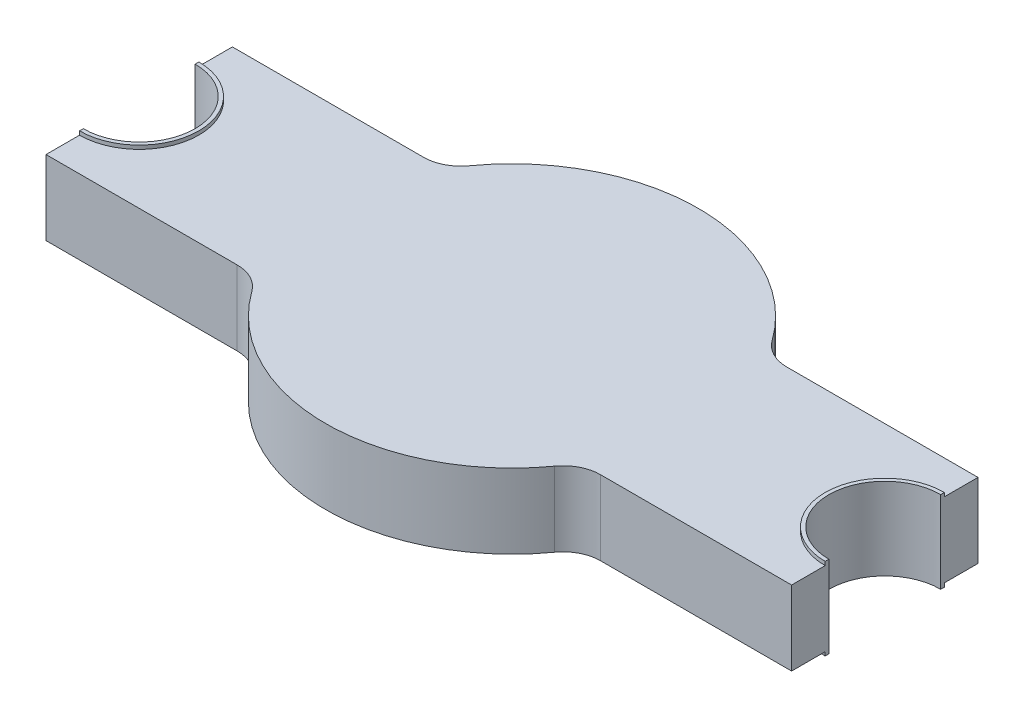
ISO-10303-21;
HEADER;
FILE_DESCRIPTION(('STEP AP214'),'2;1');
FILE_NAME('part.step','',(''),(''),'','','');
FILE_SCHEMA(('AUTOMOTIVE_DESIGN { 1 0 10303 214 1 1 1 1 }'));
ENDSEC;
DATA;
#1=APPLICATION_CONTEXT('core data for automotive mechanical design processes');
#2=APPLICATION_PROTOCOL_DEFINITION('international standard','automotive_design',2000,#1);
#3=PRODUCT_CONTEXT('',#1,'mechanical');
#4=PRODUCT('Part','Part','',(#3));
#5=PRODUCT_RELATED_PRODUCT_CATEGORY('part','',(#4));
#6=PRODUCT_DEFINITION_FORMATION('','',#4);
#7=PRODUCT_DEFINITION_CONTEXT('part definition',#1,'design');
#8=PRODUCT_DEFINITION('design','',#6,#7);
#9=PRODUCT_DEFINITION_SHAPE('','',#8);
#10=(LENGTH_UNIT() NAMED_UNIT(*) SI_UNIT(.MILLI.,.METRE.));
#11=(NAMED_UNIT(*) PLANE_ANGLE_UNIT() SI_UNIT($,.RADIAN.));
#12=(NAMED_UNIT(*) SI_UNIT($,.STERADIAN.) SOLID_ANGLE_UNIT());
#13=UNCERTAINTY_MEASURE_WITH_UNIT(LENGTH_MEASURE(1.E-05),#10,'distance_accuracy_value','');
#14=(GEOMETRIC_REPRESENTATION_CONTEXT(3) GLOBAL_UNCERTAINTY_ASSIGNED_CONTEXT((#13)) GLOBAL_UNIT_ASSIGNED_CONTEXT((#10,
#11,#12)) REPRESENTATION_CONTEXT('',''));
#15=CARTESIAN_POINT('',(0.,0.,0.));
#16=DIRECTION('',(0.,0.,1.));
#17=DIRECTION('',(1.,0.,0.));
#18=AXIS2_PLACEMENT_3D('',#15,#16,#17);
#19=CARTESIAN_POINT('',(0.,20.,0.));
#20=DIRECTION('',(0.,1.,0.));
#21=DIRECTION('',(0.,0.,1.));
#22=AXIS2_PLACEMENT_3D('',#19,#20,#21);
#23=PLANE('',#22);
#24=DIRECTION('',(0.,0.,-1.));
#25=VECTOR('',#24,1.);
#26=CARTESIAN_POINT('',(100.,20.,0.));
#27=LINE('',#26,#25);
#28=CARTESIAN_POINT('',(100.,20.,25.));
#29=VERTEX_POINT('',#28);
#30=CARTESIAN_POINT('',(100.,20.,16.));
#31=VERTEX_POINT('',#30);
#32=EDGE_CURVE('E58',#29,#31,#27,.T.);
#33=ORIENTED_EDGE('',*,*,#32,.T.);
#34=CARTESIAN_POINT('',(100.,20.,0.));
#35=DIRECTION('',(0.,1.,0.));
#36=DIRECTION('',(0.,0.,1.));
#37=AXIS2_PLACEMENT_3D('',#34,#35,#36);
#38=CIRCLE('',#37,16.);
#39=CARTESIAN_POINT('',(100.,20.,-16.));
#40=VERTEX_POINT('',#39);
#41=EDGE_CURVE('E53',#31,#40,#38,.F.);
#42=ORIENTED_EDGE('',*,*,#41,.T.);
#43=CARTESIAN_POINT('',(100.,20.,-25.));
#44=VERTEX_POINT('',#43);
#45=EDGE_CURVE('E305',#40,#44,#27,.T.);
#46=ORIENTED_EDGE('',*,*,#45,.T.);
#47=DIRECTION('',(1.,0.,0.));
#48=VECTOR('',#47,1.);
#49=CARTESIAN_POINT('',(0.,20.,-25.));
#50=LINE('',#49,#48);
#51=CARTESIAN_POINT('',(48.7339717240448,20.,-25.));
#52=VERTEX_POINT('',#51);
#53=EDGE_CURVE('E307',#52,#44,#50,.T.);
#54=ORIENTED_EDGE('',*,*,#53,.F.);
#55=CARTESIAN_POINT('',(48.7339717240448,20.,-35.));
#56=DIRECTION('',(0.,1.,0.));
#57=DIRECTION('',(0.,0.,1.));
#58=AXIS2_PLACEMENT_3D('',#55,#56,#57);
#59=CIRCLE('',#58,10.);
#60=CARTESIAN_POINT('',(40.6116431033707,20.,-29.1666666666667));
#61=VERTEX_POINT('',#60);
#62=EDGE_CURVE('E373',#52,#61,#59,.F.);
#63=ORIENTED_EDGE('',*,*,#62,.T.);
#64=CARTESIAN_POINT('',(0.,20.,0.));
#65=DIRECTION('',(0.,1.,0.));
#66=DIRECTION('',(0.,0.,1.));
#67=AXIS2_PLACEMENT_3D('',#64,#65,#66);
#68=CIRCLE('',#67,50.);
#69=CARTESIAN_POINT('',(-40.6116431033707,20.,-29.1666666666667));
#70=VERTEX_POINT('',#69);
#71=EDGE_CURVE('E286',#61,#70,#68,.T.);
#72=ORIENTED_EDGE('',*,*,#71,.T.);
#73=CARTESIAN_POINT('',(-48.7339717240448,20.,-35.));
#74=DIRECTION('',(0.,1.,0.));
#75=DIRECTION('',(0.,0.,1.));
#76=AXIS2_PLACEMENT_3D('',#73,#74,#75);
#77=CIRCLE('',#76,10.);
#78=CARTESIAN_POINT('',(-48.7339717240448,20.,-25.));
#79=VERTEX_POINT('',#78);
#80=EDGE_CURVE('E377',#70,#79,#77,.F.);
#81=ORIENTED_EDGE('',*,*,#80,.T.);
#82=DIRECTION('',(1.,0.,0.));
#83=VECTOR('',#82,1.);
#84=CARTESIAN_POINT('',(0.,20.,-25.));
#85=LINE('',#84,#83);
#86=CARTESIAN_POINT('',(-100.,20.,-25.));
#87=VERTEX_POINT('',#86);
#88=EDGE_CURVE('E289',#87,#79,#85,.T.);
#89=ORIENTED_EDGE('',*,*,#88,.F.);
#90=DIRECTION('',(0.,0.,-1.));
#91=VECTOR('',#90,1.);
#92=CARTESIAN_POINT('',(-100.,20.,0.));
#93=LINE('',#92,#91);
#94=CARTESIAN_POINT('',(-100.,20.,-16.));
#95=VERTEX_POINT('',#94);
#96=EDGE_CURVE('E293',#95,#87,#93,.T.);
#97=ORIENTED_EDGE('',*,*,#96,.F.);
#98=CARTESIAN_POINT('',(-100.,20.,0.));
#99=DIRECTION('',(0.,1.,0.));
#100=DIRECTION('',(0.,0.,1.));
#101=AXIS2_PLACEMENT_3D('',#98,#99,#100);
#102=CIRCLE('',#101,16.);
#103=CARTESIAN_POINT('',(-100.,20.,16.));
#104=VERTEX_POINT('',#103);
#105=EDGE_CURVE('E272',#104,#95,#102,.T.);
#106=ORIENTED_EDGE('',*,*,#105,.F.);
#107=CARTESIAN_POINT('',(-100.,20.,25.));
#108=VERTEX_POINT('',#107);
#109=EDGE_CURVE('E294',#108,#104,#93,.T.);
#110=ORIENTED_EDGE('',*,*,#109,.F.);
#111=DIRECTION('',(1.,0.,0.));
#112=VECTOR('',#111,1.);
#113=CARTESIAN_POINT('',(0.,20.,25.));
#114=LINE('',#113,#112);
#115=CARTESIAN_POINT('',(-48.7339717240448,20.,25.));
#116=VERTEX_POINT('',#115);
#117=EDGE_CURVE('E297',#108,#116,#114,.T.);
#118=ORIENTED_EDGE('',*,*,#117,.T.);
#119=CARTESIAN_POINT('',(-48.7339717240448,20.,35.));
#120=DIRECTION('',(0.,1.,0.));
#121=DIRECTION('',(0.,0.,1.));
#122=AXIS2_PLACEMENT_3D('',#119,#120,#121);
#123=CIRCLE('',#122,10.);
#124=CARTESIAN_POINT('',(-40.6116431033707,20.,29.1666666666667));
#125=VERTEX_POINT('',#124);
#126=EDGE_CURVE('E350',#116,#125,#123,.F.);
#127=ORIENTED_EDGE('',*,*,#126,.T.);
#128=CARTESIAN_POINT('',(0.,20.,0.));
#129=DIRECTION('',(0.,1.,0.));
#130=DIRECTION('',(0.,0.,1.));
#131=AXIS2_PLACEMENT_3D('',#128,#129,#130);
#132=CIRCLE('',#131,50.);
#133=CARTESIAN_POINT('',(40.6116431033707,20.,29.1666666666667));
#134=VERTEX_POINT('',#133);
#135=EDGE_CURVE('E300',#125,#134,#132,.T.);
#136=ORIENTED_EDGE('',*,*,#135,.T.);
#137=CARTESIAN_POINT('',(48.7339717240448,20.,35.));
#138=DIRECTION('',(0.,1.,0.));
#139=DIRECTION('',(0.,0.,1.));
#140=AXIS2_PLACEMENT_3D('',#137,#138,#139);
#141=CIRCLE('',#140,10.);
#142=CARTESIAN_POINT('',(48.7339717240448,20.,25.));
#143=VERTEX_POINT('',#142);
#144=EDGE_CURVE('E369',#134,#143,#141,.F.);
#145=ORIENTED_EDGE('',*,*,#144,.T.);
#146=DIRECTION('',(1.,0.,0.));
#147=VECTOR('',#146,1.);
#148=CARTESIAN_POINT('',(0.,20.,25.));
#149=LINE('',#148,#147);
#150=EDGE_CURVE('E303',#143,#29,#149,.T.);
#151=ORIENTED_EDGE('',*,*,#150,.T.);
#152=EDGE_LOOP('',(#33,#42,#46,#54,#63,#72,#81,#89,#97,#106,#110,#118,#127,#136,#145,#151));
#153=FACE_BOUND('',#152,.T.);
#154=ADVANCED_FACE('F38',(#153),#23,.T.);
#155=CARTESIAN_POINT('',(0.,0.,0.));
#156=DIRECTION('',(0.,1.,0.));
#157=DIRECTION('',(0.,0.,1.));
#158=AXIS2_PLACEMENT_3D('',#155,#156,#157);
#159=PLANE('',#158);
#160=CARTESIAN_POINT('',(0.,0.,0.));
#161=DIRECTION('',(0.,1.,0.));
#162=DIRECTION('',(0.,0.,1.));
#163=AXIS2_PLACEMENT_3D('',#160,#161,#162);
#164=CIRCLE('',#163,40.);
#165=CARTESIAN_POINT('',(0.,0.,40.));
#166=VERTEX_POINT('',#165);
#167=EDGE_CURVE('E394',#166,#166,#164,.T.);
#168=ORIENTED_EDGE('',*,*,#167,.T.);
#169=EDGE_LOOP('',(#168));
#170=FACE_BOUND('',#169,.T.);
#171=CARTESIAN_POINT('',(100.,0.,0.));
#172=DIRECTION('',(0.,1.,0.));
#173=DIRECTION('',(0.,0.,1.));
#174=AXIS2_PLACEMENT_3D('',#171,#172,#173);
#175=CIRCLE('',#174,16.);
#176=CARTESIAN_POINT('',(100.,0.,16.));
#177=VERTEX_POINT('',#176);
#178=CARTESIAN_POINT('',(100.,0.,-16.));
#179=VERTEX_POINT('',#178);
#180=EDGE_CURVE('E239',#177,#179,#175,.F.);
#181=ORIENTED_EDGE('',*,*,#180,.F.);
#182=DIRECTION('',(0.,0.,-1.));
#183=VECTOR('',#182,1.);
#184=CARTESIAN_POINT('',(100.,0.,0.));
#185=LINE('',#184,#183);
#186=CARTESIAN_POINT('',(100.,0.,25.));
#187=VERTEX_POINT('',#186);
#188=EDGE_CURVE('E328',#187,#177,#185,.T.);
#189=ORIENTED_EDGE('',*,*,#188,.F.);
#190=DIRECTION('',(1.,0.,0.));
#191=VECTOR('',#190,1.);
#192=CARTESIAN_POINT('',(0.,0.,25.));
#193=LINE('',#192,#191);
#194=CARTESIAN_POINT('',(48.7339717240448,0.,25.));
#195=VERTEX_POINT('',#194);
#196=EDGE_CURVE('E325',#195,#187,#193,.T.);
#197=ORIENTED_EDGE('',*,*,#196,.F.);
#198=CARTESIAN_POINT('',(48.7339717240448,0.,35.));
#199=DIRECTION('',(0.,1.,0.));
#200=DIRECTION('',(0.,0.,1.));
#201=AXIS2_PLACEMENT_3D('',#198,#199,#200);
#202=CIRCLE('',#201,10.);
#203=CARTESIAN_POINT('',(40.6116431033707,0.,29.1666666666667));
#204=VERTEX_POINT('',#203);
#205=EDGE_CURVE('E367',#195,#204,#202,.T.);
#206=ORIENTED_EDGE('',*,*,#205,.T.);
#207=CARTESIAN_POINT('',(0.,0.,0.));
#208=DIRECTION('',(0.,1.,0.));
#209=DIRECTION('',(0.,0.,1.));
#210=AXIS2_PLACEMENT_3D('',#207,#208,#209);
#211=CIRCLE('',#210,50.);
#212=CARTESIAN_POINT('',(-40.6116431033707,0.,29.1666666666667));
#213=VERTEX_POINT('',#212);
#214=EDGE_CURVE('E322',#213,#204,#211,.T.);
#215=ORIENTED_EDGE('',*,*,#214,.F.);
#216=CARTESIAN_POINT('',(-48.7339717240448,0.,35.));
#217=DIRECTION('',(0.,1.,0.));
#218=DIRECTION('',(0.,0.,1.));
#219=AXIS2_PLACEMENT_3D('',#216,#217,#218);
#220=CIRCLE('',#219,10.);
#221=CARTESIAN_POINT('',(-48.7339717240448,0.,25.));
#222=VERTEX_POINT('',#221);
#223=EDGE_CURVE('E348',#213,#222,#220,.T.);
#224=ORIENTED_EDGE('',*,*,#223,.T.);
#225=DIRECTION('',(1.,0.,0.));
#226=VECTOR('',#225,1.);
#227=CARTESIAN_POINT('',(0.,0.,25.));
#228=LINE('',#227,#226);
#229=CARTESIAN_POINT('',(-100.,0.,25.));
#230=VERTEX_POINT('',#229);
#231=EDGE_CURVE('E319',#230,#222,#228,.T.);
#232=ORIENTED_EDGE('',*,*,#231,.F.);
#233=DIRECTION('',(0.,0.,-1.));
#234=VECTOR('',#233,1.);
#235=CARTESIAN_POINT('',(-100.,0.,0.));
#236=LINE('',#235,#234);
#237=CARTESIAN_POINT('',(-100.,0.,16.));
#238=VERTEX_POINT('',#237);
#239=EDGE_CURVE('E317',#230,#238,#236,.T.);
#240=ORIENTED_EDGE('',*,*,#239,.T.);
#241=CARTESIAN_POINT('',(-100.,0.,0.));
#242=DIRECTION('',(0.,1.,0.));
#243=DIRECTION('',(0.,0.,1.));
#244=AXIS2_PLACEMENT_3D('',#241,#242,#243);
#245=CIRCLE('',#244,16.);
#246=CARTESIAN_POINT('',(-100.,0.,-16.));
#247=VERTEX_POINT('',#246);
#248=EDGE_CURVE('E379',#238,#247,#245,.T.);
#249=ORIENTED_EDGE('',*,*,#248,.T.);
#250=CARTESIAN_POINT('',(-100.,0.,-25.));
#251=VERTEX_POINT('',#250);
#252=EDGE_CURVE('E316',#247,#251,#236,.T.);
#253=ORIENTED_EDGE('',*,*,#252,.T.);
#254=DIRECTION('',(1.,0.,0.));
#255=VECTOR('',#254,1.);
#256=CARTESIAN_POINT('',(0.,0.,-25.));
#257=LINE('',#256,#255);
#258=CARTESIAN_POINT('',(-48.7339717240448,0.,-25.));
#259=VERTEX_POINT('',#258);
#260=EDGE_CURVE('E313',#251,#259,#257,.T.);
#261=ORIENTED_EDGE('',*,*,#260,.T.);
#262=CARTESIAN_POINT('',(-48.7339717240448,0.,-35.));
#263=DIRECTION('',(0.,1.,0.));
#264=DIRECTION('',(0.,0.,1.));
#265=AXIS2_PLACEMENT_3D('',#262,#263,#264);
#266=CIRCLE('',#265,10.);
#267=CARTESIAN_POINT('',(-40.6116431033707,0.,-29.1666666666667));
#268=VERTEX_POINT('',#267);
#269=EDGE_CURVE('E375',#259,#268,#266,.T.);
#270=ORIENTED_EDGE('',*,*,#269,.T.);
#271=CARTESIAN_POINT('',(0.,0.,0.));
#272=DIRECTION('',(0.,1.,0.));
#273=DIRECTION('',(0.,0.,1.));
#274=AXIS2_PLACEMENT_3D('',#271,#272,#273);
#275=CIRCLE('',#274,50.);
#276=CARTESIAN_POINT('',(40.6116431033707,0.,-29.1666666666667));
#277=VERTEX_POINT('',#276);
#278=EDGE_CURVE('E285',#277,#268,#275,.T.);
#279=ORIENTED_EDGE('',*,*,#278,.F.);
#280=CARTESIAN_POINT('',(48.7339717240448,0.,-35.));
#281=DIRECTION('',(0.,1.,0.));
#282=DIRECTION('',(0.,0.,1.));
#283=AXIS2_PLACEMENT_3D('',#280,#281,#282);
#284=CIRCLE('',#283,10.);
#285=CARTESIAN_POINT('',(48.7339717240448,0.,-25.));
#286=VERTEX_POINT('',#285);
#287=EDGE_CURVE('E371',#277,#286,#284,.T.);
#288=ORIENTED_EDGE('',*,*,#287,.T.);
#289=DIRECTION('',(1.,0.,0.));
#290=VECTOR('',#289,1.);
#291=CARTESIAN_POINT('',(0.,0.,-25.));
#292=LINE('',#291,#290);
#293=CARTESIAN_POINT('',(100.,0.,-25.));
#294=VERTEX_POINT('',#293);
#295=EDGE_CURVE('E290',#286,#294,#292,.T.);
#296=ORIENTED_EDGE('',*,*,#295,.T.);
#297=EDGE_CURVE('E327',#179,#294,#185,.T.);
#298=ORIENTED_EDGE('',*,*,#297,.F.);
#299=EDGE_LOOP('',(#181,#189,#197,#206,#215,#224,#232,#240,#249,#253,#261,#270,#279,#288,#296,#298));
#300=FACE_BOUND('',#299,.T.);
#301=ADVANCED_FACE('F433',(#170,#300),#159,.F.);
#302=CARTESIAN_POINT('',(-100.,20.,0.));
#303=DIRECTION('',(-1.,0.,0.));
#304=DIRECTION('',(0.,0.,1.));
#305=AXIS2_PLACEMENT_3D('',#302,#303,#304);
#306=PLANE('',#305);
#307=ORIENTED_EDGE('',*,*,#252,.F.);
#308=DIRECTION('',(0.,1.,0.));
#309=VECTOR('',#308,1.);
#310=CARTESIAN_POINT('',(-100.,-1.,-16.));
#311=LINE('',#310,#309);
#312=CARTESIAN_POINT('',(-100.,-1.,-16.));
#313=VERTEX_POINT('',#312);
#314=EDGE_CURVE('E269',#313,#247,#311,.T.);
#315=ORIENTED_EDGE('',*,*,#314,.F.);
#316=DIRECTION('',(0.,0.,1.));
#317=VECTOR('',#316,1.);
#318=CARTESIAN_POINT('',(-100.,-1.,0.));
#319=LINE('',#318,#317);
#320=CARTESIAN_POINT('',(-100.,-1.,-15.));
#321=VERTEX_POINT('',#320);
#322=EDGE_CURVE('E265',#313,#321,#319,.T.);
#323=ORIENTED_EDGE('',*,*,#322,.T.);
#324=DIRECTION('',(0.,-1.,0.));
#325=VECTOR('',#324,1.);
#326=CARTESIAN_POINT('',(-100.,20.,-15.));
#327=LINE('',#326,#325);
#328=CARTESIAN_POINT('',(-100.,21.,-15.));
#329=VERTEX_POINT('',#328);
#330=EDGE_CURVE('E283',#321,#329,#327,.F.);
#331=ORIENTED_EDGE('',*,*,#330,.T.);
#332=DIRECTION('',(0.,0.,1.));
#333=VECTOR('',#332,1.);
#334=CARTESIAN_POINT('',(-100.,21.,0.));
#335=LINE('',#334,#333);
#336=CARTESIAN_POINT('',(-100.,21.,-16.));
#337=VERTEX_POINT('',#336);
#338=EDGE_CURVE('E253',#337,#329,#335,.T.);
#339=ORIENTED_EDGE('',*,*,#338,.F.);
#340=EDGE_CURVE('E273',#95,#337,#311,.T.);
#341=ORIENTED_EDGE('',*,*,#340,.F.);
#342=ORIENTED_EDGE('',*,*,#96,.T.);
#343=DIRECTION('',(0.,-1.,0.));
#344=VECTOR('',#343,1.);
#345=CARTESIAN_POINT('',(-100.,20.,-25.));
#346=LINE('',#345,#344);
#347=EDGE_CURVE('E340',#87,#251,#346,.T.);
#348=ORIENTED_EDGE('',*,*,#347,.T.);
#349=EDGE_LOOP('',(#307,#315,#323,#331,#339,#341,#342,#348));
#350=FACE_BOUND('',#349,.T.);
#351=ADVANCED_FACE('F438',(#350),#306,.T.);
#352=ORIENTED_EDGE('',*,*,#109,.T.);
#353=DIRECTION('',(0.,1.,0.));
#354=VECTOR('',#353,1.);
#355=CARTESIAN_POINT('',(-100.,-1.,16.));
#356=LINE('',#355,#354);
#357=CARTESIAN_POINT('',(-100.,21.,16.));
#358=VERTEX_POINT('',#357);
#359=EDGE_CURVE('E268',#104,#358,#356,.T.);
#360=ORIENTED_EDGE('',*,*,#359,.T.);
#361=DIRECTION('',(0.,0.,1.));
#362=VECTOR('',#361,1.);
#363=CARTESIAN_POINT('',(-100.,21.,0.));
#364=LINE('',#363,#362);
#365=CARTESIAN_POINT('',(-100.,21.,15.));
#366=VERTEX_POINT('',#365);
#367=EDGE_CURVE('E247',#366,#358,#364,.T.);
#368=ORIENTED_EDGE('',*,*,#367,.F.);
#369=DIRECTION('',(0.,-1.,0.));
#370=VECTOR('',#369,1.);
#371=CARTESIAN_POINT('',(-100.,20.,15.));
#372=LINE('',#371,#370);
#373=CARTESIAN_POINT('',(-100.,-1.,15.));
#374=VERTEX_POINT('',#373);
#375=EDGE_CURVE('E281',#366,#374,#372,.T.);
#376=ORIENTED_EDGE('',*,*,#375,.T.);
#377=DIRECTION('',(0.,0.,1.));
#378=VECTOR('',#377,1.);
#379=CARTESIAN_POINT('',(-100.,-1.,0.));
#380=LINE('',#379,#378);
#381=CARTESIAN_POINT('',(-100.,-1.,16.));
#382=VERTEX_POINT('',#381);
#383=EDGE_CURVE('E259',#374,#382,#380,.T.);
#384=ORIENTED_EDGE('',*,*,#383,.T.);
#385=EDGE_CURVE('E274',#382,#238,#356,.T.);
#386=ORIENTED_EDGE('',*,*,#385,.T.);
#387=ORIENTED_EDGE('',*,*,#239,.F.);
#388=DIRECTION('',(0.,-1.,0.));
#389=VECTOR('',#388,1.);
#390=CARTESIAN_POINT('',(-100.,20.,25.));
#391=LINE('',#390,#389);
#392=EDGE_CURVE('E338',#108,#230,#391,.T.);
#393=ORIENTED_EDGE('',*,*,#392,.F.);
#394=EDGE_LOOP('',(#352,#360,#368,#376,#384,#386,#387,#393));
#395=FACE_BOUND('',#394,.T.);
#396=ADVANCED_FACE('F468',(#395),#306,.T.);
#397=CARTESIAN_POINT('',(100.,20.,0.));
#398=DIRECTION('',(-1.,0.,0.));
#399=DIRECTION('',(0.,0.,1.));
#400=AXIS2_PLACEMENT_3D('',#397,#398,#399);
#401=PLANE('',#400);
#402=DIRECTION('',(0.,-1.,0.));
#403=VECTOR('',#402,1.);
#404=CARTESIAN_POINT('',(100.,20.,-15.));
#405=LINE('',#404,#403);
#406=CARTESIAN_POINT('',(100.,21.,-15.));
#407=VERTEX_POINT('',#406);
#408=CARTESIAN_POINT('',(100.,-1.,-15.));
#409=VERTEX_POINT('',#408);
#410=EDGE_CURVE('E279',#407,#409,#405,.T.);
#411=ORIENTED_EDGE('',*,*,#410,.T.);
#412=DIRECTION('',(0.,0.,1.));
#413=VECTOR('',#412,1.);
#414=CARTESIAN_POINT('',(100.,-1.,0.));
#415=LINE('',#414,#413);
#416=CARTESIAN_POINT('',(100.,-1.,-16.));
#417=VERTEX_POINT('',#416);
#418=EDGE_CURVE('E206',#417,#409,#415,.T.);
#419=ORIENTED_EDGE('',*,*,#418,.F.);
#420=DIRECTION('',(0.,1.,0.));
#421=VECTOR('',#420,1.);
#422=CARTESIAN_POINT('',(100.,-1.,-16.));
#423=LINE('',#422,#421);
#424=EDGE_CURVE('E237',#417,#179,#423,.T.);
#425=ORIENTED_EDGE('',*,*,#424,.T.);
#426=ORIENTED_EDGE('',*,*,#297,.T.);
#427=DIRECTION('',(0.,-1.,0.));
#428=VECTOR('',#427,1.);
#429=CARTESIAN_POINT('',(100.,20.,-25.));
#430=LINE('',#429,#428);
#431=EDGE_CURVE('E310',#44,#294,#430,.T.);
#432=ORIENTED_EDGE('',*,*,#431,.F.);
#433=ORIENTED_EDGE('',*,*,#45,.F.);
#434=CARTESIAN_POINT('',(100.,21.,-16.));
#435=VERTEX_POINT('',#434);
#436=EDGE_CURVE('E240',#40,#435,#423,.T.);
#437=ORIENTED_EDGE('',*,*,#436,.T.);
#438=DIRECTION('',(0.,0.,1.));
#439=VECTOR('',#438,1.);
#440=CARTESIAN_POINT('',(100.,21.,0.));
#441=LINE('',#440,#439);
#442=EDGE_CURVE('E214',#435,#407,#441,.T.);
#443=ORIENTED_EDGE('',*,*,#442,.T.);
#444=EDGE_LOOP('',(#411,#419,#425,#426,#432,#433,#437,#443));
#445=FACE_BOUND('',#444,.T.);
#446=ADVANCED_FACE('F453',(#445),#401,.F.);
#447=CARTESIAN_POINT('',(0.,20.,0.));
#448=DIRECTION('',(0.,-1.,0.));
#449=DIRECTION('',(0.,0.,-1.));
#450=AXIS2_PLACEMENT_3D('',#447,#448,#449);
#451=CYLINDRICAL_SURFACE('',#450,50.);
#452=ORIENTED_EDGE('',*,*,#71,.F.);
#453=DIRECTION('',(0.,-1.,0.));
#454=VECTOR('',#453,1.);
#455=CARTESIAN_POINT('',(40.6116431033707,20.,-29.1666666666667));
#456=LINE('',#455,#454);
#457=EDGE_CURVE('E359',#61,#277,#456,.T.);
#458=ORIENTED_EDGE('',*,*,#457,.T.);
#459=ORIENTED_EDGE('',*,*,#278,.T.);
#460=DIRECTION('',(0.,-1.,0.));
#461=VECTOR('',#460,1.);
#462=CARTESIAN_POINT('',(-40.6116431033707,20.,-29.1666666666667));
#463=LINE('',#462,#461);
#464=EDGE_CURVE('E357',#268,#70,#463,.F.);
#465=ORIENTED_EDGE('',*,*,#464,.T.);
#466=EDGE_LOOP('',(#452,#458,#459,#465));
#467=FACE_BOUND('',#466,.T.);
#468=ADVANCED_FACE('F472',(#467),#451,.T.);
#469=CARTESIAN_POINT('',(0.,20.,-25.));
#470=DIRECTION('',(0.,0.,-1.));
#471=DIRECTION('',(-1.,0.,0.));
#472=AXIS2_PLACEMENT_3D('',#469,#470,#471);
#473=PLANE('',#472);
#474=ORIENTED_EDGE('',*,*,#88,.T.);
#475=DIRECTION('',(0.,-1.,0.));
#476=VECTOR('',#475,1.);
#477=CARTESIAN_POINT('',(-48.7339717240448,20.,-25.));
#478=LINE('',#477,#476);
#479=EDGE_CURVE('E364',#79,#259,#478,.T.);
#480=ORIENTED_EDGE('',*,*,#479,.T.);
#481=ORIENTED_EDGE('',*,*,#260,.F.);
#482=ORIENTED_EDGE('',*,*,#347,.F.);
#483=EDGE_LOOP('',(#474,#480,#481,#482));
#484=FACE_BOUND('',#483,.T.);
#485=ADVANCED_FACE('F464',(#484),#473,.T.);
#486=CARTESIAN_POINT('',(0.,20.,25.));
#487=DIRECTION('',(0.,0.,-1.));
#488=DIRECTION('',(-1.,0.,0.));
#489=AXIS2_PLACEMENT_3D('',#486,#487,#488);
#490=PLANE('',#489);
#491=ORIENTED_EDGE('',*,*,#231,.T.);
#492=DIRECTION('',(0.,1.,0.));
#493=VECTOR('',#492,1.);
#494=CARTESIAN_POINT('',(-48.7339717240448,20.,25.));
#495=LINE('',#494,#493);
#496=EDGE_CURVE('E346',#222,#116,#495,.T.);
#497=ORIENTED_EDGE('',*,*,#496,.T.);
#498=ORIENTED_EDGE('',*,*,#117,.F.);
#499=ORIENTED_EDGE('',*,*,#392,.T.);
#500=EDGE_LOOP('',(#491,#497,#498,#499));
#501=FACE_BOUND('',#500,.T.);
#502=ADVANCED_FACE('F460',(#501),#490,.F.);
#503=CARTESIAN_POINT('',(0.,20.,0.));
#504=DIRECTION('',(0.,-1.,0.));
#505=DIRECTION('',(0.,0.,-1.));
#506=AXIS2_PLACEMENT_3D('',#503,#504,#505);
#507=CYLINDRICAL_SURFACE('',#506,50.);
#508=ORIENTED_EDGE('',*,*,#214,.T.);
#509=DIRECTION('',(0.,-1.,0.));
#510=VECTOR('',#509,1.);
#511=CARTESIAN_POINT('',(40.6116431033707,20.,29.1666666666667));
#512=LINE('',#511,#510);
#513=EDGE_CURVE('E355',#204,#134,#512,.F.);
#514=ORIENTED_EDGE('',*,*,#513,.T.);
#515=ORIENTED_EDGE('',*,*,#135,.F.);
#516=DIRECTION('',(0.,-1.,0.));
#517=VECTOR('',#516,1.);
#518=CARTESIAN_POINT('',(-40.6116431033707,20.,29.1666666666667));
#519=LINE('',#518,#517);
#520=EDGE_CURVE('E343',#125,#213,#519,.T.);
#521=ORIENTED_EDGE('',*,*,#520,.T.);
#522=EDGE_LOOP('',(#508,#514,#515,#521));
#523=FACE_BOUND('',#522,.T.);
#524=ADVANCED_FACE('F456',(#523),#507,.T.);
#525=CARTESIAN_POINT('',(0.,20.,25.));
#526=DIRECTION('',(0.,0.,-1.));
#527=DIRECTION('',(-1.,0.,0.));
#528=AXIS2_PLACEMENT_3D('',#525,#526,#527);
#529=PLANE('',#528);
#530=ORIENTED_EDGE('',*,*,#150,.F.);
#531=DIRECTION('',(0.,1.,0.));
#532=VECTOR('',#531,1.);
#533=CARTESIAN_POINT('',(48.7339717240448,0.,25.));
#534=LINE('',#533,#532);
#535=EDGE_CURVE('E352',#143,#195,#534,.F.);
#536=ORIENTED_EDGE('',*,*,#535,.T.);
#537=ORIENTED_EDGE('',*,*,#196,.T.);
#538=DIRECTION('',(0.,-1.,0.));
#539=VECTOR('',#538,1.);
#540=CARTESIAN_POINT('',(100.,20.,25.));
#541=LINE('',#540,#539);
#542=EDGE_CURVE('E335',#29,#187,#541,.T.);
#543=ORIENTED_EDGE('',*,*,#542,.F.);
#544=EDGE_LOOP('',(#530,#536,#537,#543));
#545=FACE_BOUND('',#544,.T.);
#546=ADVANCED_FACE('F452',(#545),#529,.F.);
#547=DIRECTION('',(0.,-1.,0.));
#548=VECTOR('',#547,1.);
#549=CARTESIAN_POINT('',(100.,20.,15.));
#550=LINE('',#549,#548);
#551=CARTESIAN_POINT('',(100.,-1.,15.));
#552=VERTEX_POINT('',#551);
#553=CARTESIAN_POINT('',(100.,21.,15.));
#554=VERTEX_POINT('',#553);
#555=EDGE_CURVE('E219',#552,#554,#550,.F.);
#556=ORIENTED_EDGE('',*,*,#555,.T.);
#557=DIRECTION('',(0.,0.,1.));
#558=VECTOR('',#557,1.);
#559=CARTESIAN_POINT('',(100.,21.,0.));
#560=LINE('',#559,#558);
#561=CARTESIAN_POINT('',(100.,21.,16.));
#562=VERTEX_POINT('',#561);
#563=EDGE_CURVE('E212',#554,#562,#560,.T.);
#564=ORIENTED_EDGE('',*,*,#563,.T.);
#565=DIRECTION('',(0.,1.,0.));
#566=VECTOR('',#565,1.);
#567=CARTESIAN_POINT('',(100.,-1.,16.));
#568=LINE('',#567,#566);
#569=EDGE_CURVE('E197',#31,#562,#568,.T.);
#570=ORIENTED_EDGE('',*,*,#569,.F.);
#571=ORIENTED_EDGE('',*,*,#32,.F.);
#572=ORIENTED_EDGE('',*,*,#542,.T.);
#573=ORIENTED_EDGE('',*,*,#188,.T.);
#574=CARTESIAN_POINT('',(100.,-1.,16.));
#575=VERTEX_POINT('',#574);
#576=EDGE_CURVE('E205',#575,#177,#568,.T.);
#577=ORIENTED_EDGE('',*,*,#576,.F.);
#578=DIRECTION('',(0.,0.,1.));
#579=VECTOR('',#578,1.);
#580=CARTESIAN_POINT('',(100.,-1.,0.));
#581=LINE('',#580,#579);
#582=EDGE_CURVE('E230',#552,#575,#581,.T.);
#583=ORIENTED_EDGE('',*,*,#582,.F.);
#584=EDGE_LOOP('',(#556,#564,#570,#571,#572,#573,#577,#583));
#585=FACE_BOUND('',#584,.T.);
#586=ADVANCED_FACE('F217',(#585),#401,.F.);
#587=CARTESIAN_POINT('',(0.,20.,-25.));
#588=DIRECTION('',(0.,0.,-1.));
#589=DIRECTION('',(-1.,0.,0.));
#590=AXIS2_PLACEMENT_3D('',#587,#588,#589);
#591=PLANE('',#590);
#592=ORIENTED_EDGE('',*,*,#295,.F.);
#593=DIRECTION('',(0.,-1.,0.));
#594=VECTOR('',#593,1.);
#595=CARTESIAN_POINT('',(48.7339717240448,20.,-25.));
#596=LINE('',#595,#594);
#597=EDGE_CURVE('E362',#286,#52,#596,.F.);
#598=ORIENTED_EDGE('',*,*,#597,.T.);
#599=ORIENTED_EDGE('',*,*,#53,.T.);
#600=ORIENTED_EDGE('',*,*,#431,.T.);
#601=EDGE_LOOP('',(#592,#598,#599,#600));
#602=FACE_BOUND('',#601,.T.);
#603=ADVANCED_FACE('F445',(#602),#591,.T.);
#604=CARTESIAN_POINT('',(-48.7339717240448,20.,35.));
#605=DIRECTION('',(0.,-1.,0.));
#606=DIRECTION('',(0.,0.,-1.));
#607=AXIS2_PLACEMENT_3D('',#604,#605,#606);
#608=CYLINDRICAL_SURFACE('',#607,10.);
#609=ORIENTED_EDGE('',*,*,#126,.F.);
#610=ORIENTED_EDGE('',*,*,#496,.F.);
#611=ORIENTED_EDGE('',*,*,#223,.F.);
#612=ORIENTED_EDGE('',*,*,#520,.F.);
#613=EDGE_LOOP('',(#609,#610,#611,#612));
#614=FACE_BOUND('',#613,.T.);
#615=ADVANCED_FACE('F448',(#614),#608,.F.);
#616=CARTESIAN_POINT('',(48.7339717240448,20.,35.));
#617=DIRECTION('',(0.,-1.,0.));
#618=DIRECTION('',(0.,0.,-1.));
#619=AXIS2_PLACEMENT_3D('',#616,#617,#618);
#620=CYLINDRICAL_SURFACE('',#619,10.);
#621=ORIENTED_EDGE('',*,*,#144,.F.);
#622=ORIENTED_EDGE('',*,*,#513,.F.);
#623=ORIENTED_EDGE('',*,*,#205,.F.);
#624=ORIENTED_EDGE('',*,*,#535,.F.);
#625=EDGE_LOOP('',(#621,#622,#623,#624));
#626=FACE_BOUND('',#625,.T.);
#627=ADVANCED_FACE('F479',(#626),#620,.F.);
#628=CARTESIAN_POINT('',(48.7339717240448,20.,-35.));
#629=DIRECTION('',(0.,-1.,0.));
#630=DIRECTION('',(0.,0.,-1.));
#631=AXIS2_PLACEMENT_3D('',#628,#629,#630);
#632=CYLINDRICAL_SURFACE('',#631,10.);
#633=ORIENTED_EDGE('',*,*,#62,.F.);
#634=ORIENTED_EDGE('',*,*,#597,.F.);
#635=ORIENTED_EDGE('',*,*,#287,.F.);
#636=ORIENTED_EDGE('',*,*,#457,.F.);
#637=EDGE_LOOP('',(#633,#634,#635,#636));
#638=FACE_BOUND('',#637,.T.);
#639=ADVANCED_FACE('F482',(#638),#632,.F.);
#640=CARTESIAN_POINT('',(-48.7339717240448,20.,-35.));
#641=DIRECTION('',(0.,-1.,0.));
#642=DIRECTION('',(0.,0.,-1.));
#643=AXIS2_PLACEMENT_3D('',#640,#641,#642);
#644=CYLINDRICAL_SURFACE('',#643,10.);
#645=ORIENTED_EDGE('',*,*,#80,.F.);
#646=ORIENTED_EDGE('',*,*,#464,.F.);
#647=ORIENTED_EDGE('',*,*,#269,.F.);
#648=ORIENTED_EDGE('',*,*,#479,.F.);
#649=EDGE_LOOP('',(#645,#646,#647,#648));
#650=FACE_BOUND('',#649,.T.);
#651=ADVANCED_FACE('F40',(#650),#644,.F.);
#652=CARTESIAN_POINT('',(100.,20.,0.));
#653=DIRECTION('',(0.,-1.,0.));
#654=DIRECTION('',(0.,0.,-1.));
#655=AXIS2_PLACEMENT_3D('',#652,#653,#654);
#656=CYLINDRICAL_SURFACE('',#655,15.);
#657=ORIENTED_EDGE('',*,*,#410,.F.);
#658=CARTESIAN_POINT('',(100.,21.,0.));
#659=DIRECTION('',(0.,1.,0.));
#660=DIRECTION('',(0.,0.,1.));
#661=AXIS2_PLACEMENT_3D('',#658,#659,#660);
#662=CIRCLE('',#661,15.);
#663=EDGE_CURVE('E221',#554,#407,#662,.F.);
#664=ORIENTED_EDGE('',*,*,#663,.F.);
#665=ORIENTED_EDGE('',*,*,#555,.F.);
#666=CARTESIAN_POINT('',(100.,-1.,0.));
#667=DIRECTION('',(0.,1.,0.));
#668=DIRECTION('',(0.,0.,1.));
#669=AXIS2_PLACEMENT_3D('',#666,#667,#668);
#670=CIRCLE('',#669,15.);
#671=EDGE_CURVE('E232',#552,#409,#670,.F.);
#672=ORIENTED_EDGE('',*,*,#671,.T.);
#673=EDGE_LOOP('',(#657,#664,#665,#672));
#674=FACE_BOUND('',#673,.T.);
#675=ADVANCED_FACE('F442',(#674),#656,.F.);
#676=CARTESIAN_POINT('',(-100.,20.,0.));
#677=DIRECTION('',(0.,-1.,0.));
#678=DIRECTION('',(0.,0.,-1.));
#679=AXIS2_PLACEMENT_3D('',#676,#677,#678);
#680=CYLINDRICAL_SURFACE('',#679,15.);
#681=ORIENTED_EDGE('',*,*,#330,.F.);
#682=CARTESIAN_POINT('',(-100.,-1.,0.));
#683=DIRECTION('',(0.,1.,0.));
#684=DIRECTION('',(0.,0.,1.));
#685=AXIS2_PLACEMENT_3D('',#682,#683,#684);
#686=CIRCLE('',#685,15.);
#687=EDGE_CURVE('E256',#374,#321,#686,.T.);
#688=ORIENTED_EDGE('',*,*,#687,.F.);
#689=ORIENTED_EDGE('',*,*,#375,.F.);
#690=CARTESIAN_POINT('',(-100.,21.,0.));
#691=DIRECTION('',(0.,1.,0.));
#692=DIRECTION('',(0.,0.,1.));
#693=AXIS2_PLACEMENT_3D('',#690,#691,#692);
#694=CIRCLE('',#693,15.);
#695=EDGE_CURVE('E244',#366,#329,#694,.T.);
#696=ORIENTED_EDGE('',*,*,#695,.T.);
#697=EDGE_LOOP('',(#681,#688,#689,#696));
#698=FACE_BOUND('',#697,.T.);
#699=ADVANCED_FACE('F555',(#698),#680,.F.);
#700=CARTESIAN_POINT('',(0.,-1.,0.));
#701=DIRECTION('',(0.,1.,0.));
#702=DIRECTION('',(0.,0.,1.));
#703=AXIS2_PLACEMENT_3D('',#700,#701,#702);
#704=PLANE('',#703);
#705=ORIENTED_EDGE('',*,*,#687,.T.);
#706=ORIENTED_EDGE('',*,*,#322,.F.);
#707=CARTESIAN_POINT('',(-100.,-1.,0.));
#708=DIRECTION('',(0.,1.,0.));
#709=DIRECTION('',(0.,0.,1.));
#710=AXIS2_PLACEMENT_3D('',#707,#708,#709);
#711=CIRCLE('',#710,16.);
#712=EDGE_CURVE('E262',#382,#313,#711,.T.);
#713=ORIENTED_EDGE('',*,*,#712,.F.);
#714=ORIENTED_EDGE('',*,*,#383,.F.);
#715=EDGE_LOOP('',(#705,#706,#713,#714));
#716=FACE_BOUND('',#715,.T.);
#717=ADVANCED_FACE('F548',(#716),#704,.F.);
#718=CARTESIAN_POINT('',(-100.,-1.,0.));
#719=DIRECTION('',(0.,1.,0.));
#720=DIRECTION('',(0.,0.,1.));
#721=AXIS2_PLACEMENT_3D('',#718,#719,#720);
#722=CYLINDRICAL_SURFACE('',#721,16.);
#723=ORIENTED_EDGE('',*,*,#248,.F.);
#724=ORIENTED_EDGE('',*,*,#385,.F.);
#725=ORIENTED_EDGE('',*,*,#712,.T.);
#726=ORIENTED_EDGE('',*,*,#314,.T.);
#727=EDGE_LOOP('',(#723,#724,#725,#726));
#728=FACE_BOUND('',#727,.T.);
#729=ADVANCED_FACE('F543',(#728),#722,.T.);
#730=ORIENTED_EDGE('',*,*,#359,.F.);
#731=ORIENTED_EDGE('',*,*,#105,.T.);
#732=ORIENTED_EDGE('',*,*,#340,.T.);
#733=CARTESIAN_POINT('',(-100.,21.,0.));
#734=DIRECTION('',(0.,1.,0.));
#735=DIRECTION('',(0.,0.,1.));
#736=AXIS2_PLACEMENT_3D('',#733,#734,#735);
#737=CIRCLE('',#736,16.);
#738=EDGE_CURVE('E250',#358,#337,#737,.T.);
#739=ORIENTED_EDGE('',*,*,#738,.F.);
#740=EDGE_LOOP('',(#730,#731,#732,#739));
#741=FACE_BOUND('',#740,.T.);
#742=ADVANCED_FACE('F556',(#741),#722,.T.);
#743=CARTESIAN_POINT('',(0.,21.,0.));
#744=DIRECTION('',(0.,1.,0.));
#745=DIRECTION('',(0.,0.,1.));
#746=AXIS2_PLACEMENT_3D('',#743,#744,#745);
#747=PLANE('',#746);
#748=ORIENTED_EDGE('',*,*,#695,.F.);
#749=ORIENTED_EDGE('',*,*,#367,.T.);
#750=ORIENTED_EDGE('',*,*,#738,.T.);
#751=ORIENTED_EDGE('',*,*,#338,.T.);
#752=EDGE_LOOP('',(#748,#749,#750,#751));
#753=FACE_BOUND('',#752,.T.);
#754=ADVANCED_FACE('F553',(#753),#747,.T.);
#755=CARTESIAN_POINT('',(0.,-1.,0.));
#756=DIRECTION('',(0.,1.,0.));
#757=DIRECTION('',(0.,0.,1.));
#758=AXIS2_PLACEMENT_3D('',#755,#756,#757);
#759=PLANE('',#758);
#760=CARTESIAN_POINT('',(100.,-1.,0.));
#761=DIRECTION('',(0.,1.,0.));
#762=DIRECTION('',(0.,0.,1.));
#763=AXIS2_PLACEMENT_3D('',#760,#761,#762);
#764=CIRCLE('',#763,16.);
#765=EDGE_CURVE('E227',#575,#417,#764,.F.);
#766=ORIENTED_EDGE('',*,*,#765,.T.);
#767=ORIENTED_EDGE('',*,*,#418,.T.);
#768=ORIENTED_EDGE('',*,*,#671,.F.);
#769=ORIENTED_EDGE('',*,*,#582,.T.);
#770=EDGE_LOOP('',(#766,#767,#768,#769));
#771=FACE_BOUND('',#770,.T.);
#772=ADVANCED_FACE('F538',(#771),#759,.F.);
#773=CARTESIAN_POINT('',(100.,-1.,0.));
#774=DIRECTION('',(0.,1.,0.));
#775=DIRECTION('',(0.,0.,1.));
#776=AXIS2_PLACEMENT_3D('',#773,#774,#775);
#777=CYLINDRICAL_SURFACE('',#776,16.);
#778=ORIENTED_EDGE('',*,*,#576,.T.);
#779=ORIENTED_EDGE('',*,*,#180,.T.);
#780=ORIENTED_EDGE('',*,*,#424,.F.);
#781=ORIENTED_EDGE('',*,*,#765,.F.);
#782=EDGE_LOOP('',(#778,#779,#780,#781));
#783=FACE_BOUND('',#782,.T.);
#784=ADVANCED_FACE('F532',(#783),#777,.T.);
#785=ORIENTED_EDGE('',*,*,#41,.F.);
#786=ORIENTED_EDGE('',*,*,#569,.T.);
#787=CARTESIAN_POINT('',(100.,21.,0.));
#788=DIRECTION('',(0.,1.,0.));
#789=DIRECTION('',(0.,0.,1.));
#790=AXIS2_PLACEMENT_3D('',#787,#788,#789);
#791=CIRCLE('',#790,16.);
#792=EDGE_CURVE('E201',#562,#435,#791,.F.);
#793=ORIENTED_EDGE('',*,*,#792,.T.);
#794=ORIENTED_EDGE('',*,*,#436,.F.);
#795=EDGE_LOOP('',(#785,#786,#793,#794));
#796=FACE_BOUND('',#795,.T.);
#797=ADVANCED_FACE('F199',(#796),#777,.T.);
#798=CARTESIAN_POINT('',(0.,21.,0.));
#799=DIRECTION('',(0.,1.,0.));
#800=DIRECTION('',(0.,0.,1.));
#801=AXIS2_PLACEMENT_3D('',#798,#799,#800);
#802=PLANE('',#801);
#803=ORIENTED_EDGE('',*,*,#792,.F.);
#804=ORIENTED_EDGE('',*,*,#563,.F.);
#805=ORIENTED_EDGE('',*,*,#663,.T.);
#806=ORIENTED_EDGE('',*,*,#442,.F.);
#807=EDGE_LOOP('',(#803,#804,#805,#806));
#808=FACE_BOUND('',#807,.T.);
#809=ADVANCED_FACE('F210',(#808),#802,.T.);
#810=CARTESIAN_POINT('',(0.,15.,0.));
#811=DIRECTION('',(0.,-1.,0.));
#812=DIRECTION('',(0.,0.,-1.));
#813=AXIS2_PLACEMENT_3D('',#810,#811,#812);
#814=CYLINDRICAL_SURFACE('',#813,40.);
#815=CARTESIAN_POINT('',(0.,15.,0.));
#816=DIRECTION('',(0.,1.,0.));
#817=DIRECTION('',(0.,0.,1.));
#818=AXIS2_PLACEMENT_3D('',#815,#816,#817);
#819=CIRCLE('',#818,40.);
#820=CARTESIAN_POINT('',(0.,15.,40.));
#821=VERTEX_POINT('',#820);
#822=EDGE_CURVE('E215',#821,#821,#819,.T.);
#823=ORIENTED_EDGE('',*,*,#822,.T.);
#824=EDGE_LOOP('',(#823));
#825=FACE_BOUND('',#824,.T.);
#826=ORIENTED_EDGE('',*,*,#167,.F.);
#827=EDGE_LOOP('',(#826));
#828=FACE_BOUND('',#827,.T.);
#829=ADVANCED_FACE('F389',(#825,#828),#814,.F.);
#830=CARTESIAN_POINT('',(0.,15.,0.));
#831=DIRECTION('',(0.,1.,0.));
#832=DIRECTION('',(0.,0.,1.));
#833=AXIS2_PLACEMENT_3D('',#830,#831,#832);
#834=PLANE('',#833);
#835=CARTESIAN_POINT('',(0.,15.,0.));
#836=DIRECTION('',(0.,1.,0.));
#837=DIRECTION('',(0.,0.,1.));
#838=AXIS2_PLACEMENT_3D('',#835,#836,#837);
#839=CIRCLE('',#838,30.);
#840=CARTESIAN_POINT('',(0.,15.,30.));
#841=VERTEX_POINT('',#840);
#842=EDGE_CURVE('E46',#841,#841,#839,.F.);
#843=ORIENTED_EDGE('',*,*,#842,.F.);
#844=EDGE_LOOP('',(#843));
#845=FACE_BOUND('',#844,.T.);
#846=ORIENTED_EDGE('',*,*,#822,.F.);
#847=EDGE_LOOP('',(#846));
#848=FACE_BOUND('',#847,.T.);
#849=ADVANCED_FACE('F386',(#845,#848),#834,.F.);
#850=CARTESIAN_POINT('',(0.,15.,0.));
#851=DIRECTION('',(0.,-1.,0.));
#852=DIRECTION('',(0.,0.,-1.));
#853=AXIS2_PLACEMENT_3D('',#850,#851,#852);
#854=CYLINDRICAL_SURFACE('',#853,30.);
#855=ORIENTED_EDGE('',*,*,#842,.T.);
#856=EDGE_LOOP('',(#855));
#857=FACE_BOUND('',#856,.T.);
#858=CARTESIAN_POINT('',(0.,0.,0.));
#859=DIRECTION('',(0.,1.,0.));
#860=DIRECTION('',(0.,0.,1.));
#861=AXIS2_PLACEMENT_3D('',#858,#859,#860);
#862=CIRCLE('',#861,30.);
#863=CARTESIAN_POINT('',(0.,0.,30.));
#864=VERTEX_POINT('',#863);
#865=EDGE_CURVE('E397',#864,#864,#862,.T.);
#866=ORIENTED_EDGE('',*,*,#865,.T.);
#867=EDGE_LOOP('',(#866));
#868=FACE_BOUND('',#867,.T.);
#869=ADVANCED_FACE('F383',(#857,#868),#854,.T.);
#870=CARTESIAN_POINT('',(0.,0.,0.));
#871=DIRECTION('',(0.,1.,0.));
#872=DIRECTION('',(0.,0.,1.));
#873=AXIS2_PLACEMENT_3D('',#870,#871,#872);
#874=PLANE('',#873);
#875=CARTESIAN_POINT('',(0.,0.,0.));
#876=DIRECTION('',(0.,1.,0.));
#877=DIRECTION('',(0.,0.,1.));
#878=AXIS2_PLACEMENT_3D('',#875,#876,#877);
#879=CIRCLE('',#878,15.);
#880=CARTESIAN_POINT('',(0.,0.,15.));
#881=VERTEX_POINT('',#880);
#882=EDGE_CURVE('E402',#881,#881,#879,.T.);
#883=ORIENTED_EDGE('',*,*,#882,.T.);
#884=EDGE_LOOP('',(#883));
#885=FACE_BOUND('',#884,.T.);
#886=ORIENTED_EDGE('',*,*,#865,.F.);
#887=EDGE_LOOP('',(#886));
#888=FACE_BOUND('',#887,.T.);
#889=ADVANCED_FACE('F418',(#885,#888),#874,.F.);
#890=CARTESIAN_POINT('',(0.,-10.,0.));
#891=DIRECTION('',(0.,1.,0.));
#892=DIRECTION('',(0.,0.,1.));
#893=AXIS2_PLACEMENT_3D('',#890,#891,#892);
#894=CYLINDRICAL_SURFACE('',#893,10.);
#895=CARTESIAN_POINT('',(0.,-10.,0.));
#896=DIRECTION('',(0.,1.,0.));
#897=DIRECTION('',(0.,0.,1.));
#898=AXIS2_PLACEMENT_3D('',#895,#896,#897);
#899=CIRCLE('',#898,10.);
#900=CARTESIAN_POINT('',(0.,-10.,10.));
#901=VERTEX_POINT('',#900);
#902=EDGE_CURVE('E405',#901,#901,#899,.T.);
#903=ORIENTED_EDGE('',*,*,#902,.F.);
#904=EDGE_LOOP('',(#903));
#905=FACE_BOUND('',#904,.T.);
#906=CARTESIAN_POINT('',(0.,0.,0.));
#907=DIRECTION('',(0.,1.,0.));
#908=DIRECTION('',(0.,0.,1.));
#909=AXIS2_PLACEMENT_3D('',#906,#907,#908);
#910=CIRCLE('',#909,10.);
#911=CARTESIAN_POINT('',(0.,0.,10.));
#912=VERTEX_POINT('',#911);
#913=EDGE_CURVE('E11',#912,#912,#910,.T.);
#914=ORIENTED_EDGE('',*,*,#913,.T.);
#915=EDGE_LOOP('',(#914));
#916=FACE_BOUND('',#915,.T.);
#917=ADVANCED_FACE('F414',(#905,#916),#894,.F.);
#918=CARTESIAN_POINT('',(0.,-10.,0.));
#919=DIRECTION('',(0.,1.,0.));
#920=DIRECTION('',(0.,0.,1.));
#921=AXIS2_PLACEMENT_3D('',#918,#919,#920);
#922=CYLINDRICAL_SURFACE('',#921,15.);
#923=CARTESIAN_POINT('',(0.,-10.,0.));
#924=DIRECTION('',(0.,1.,0.));
#925=DIRECTION('',(0.,0.,1.));
#926=AXIS2_PLACEMENT_3D('',#923,#924,#925);
#927=CIRCLE('',#926,15.);
#928=CARTESIAN_POINT('',(0.,-10.,15.));
#929=VERTEX_POINT('',#928);
#930=EDGE_CURVE('E401',#929,#929,#927,.T.);
#931=ORIENTED_EDGE('',*,*,#930,.T.);
#932=EDGE_LOOP('',(#931));
#933=FACE_BOUND('',#932,.T.);
#934=ORIENTED_EDGE('',*,*,#882,.F.);
#935=EDGE_LOOP('',(#934));
#936=FACE_BOUND('',#935,.T.);
#937=ADVANCED_FACE('F417',(#933,#936),#922,.T.);
#938=CARTESIAN_POINT('',(0.,-10.,0.));
#939=DIRECTION('',(0.,1.,0.));
#940=DIRECTION('',(0.,0.,1.));
#941=AXIS2_PLACEMENT_3D('',#938,#939,#940);
#942=PLANE('',#941);
#943=ORIENTED_EDGE('',*,*,#902,.T.);
#944=EDGE_LOOP('',(#943));
#945=FACE_BOUND('',#944,.T.);
#946=ORIENTED_EDGE('',*,*,#930,.F.);
#947=EDGE_LOOP('',(#946));
#948=FACE_BOUND('',#947,.T.);
#949=ADVANCED_FACE('F411',(#945,#948),#942,.F.);
#950=ORIENTED_EDGE('',*,*,#913,.F.);
#951=EDGE_LOOP('',(#950));
#952=FACE_BOUND('',#951,.T.);
#953=ADVANCED_FACE('F422',(#952),#874,.F.);
#954=CLOSED_SHELL('',(#154,#301,#351,#396,#446,#468,#485,#502,#524,#546,#586,#603,#615,#627,
#639,#651,#675,#699,#717,#729,#742,#754,#772,#784,#797,#809,#829,#849,#869,#889,#917,#937,#949,#953));
#955=MANIFOLD_SOLID_BREP('B2',#954);
#956=ADVANCED_BREP_SHAPE_REPRESENTATION('',(#18,#955),#14);
#957=SHAPE_DEFINITION_REPRESENTATION(#9,#956);
ENDSEC;
END-ISO-10303-21;
